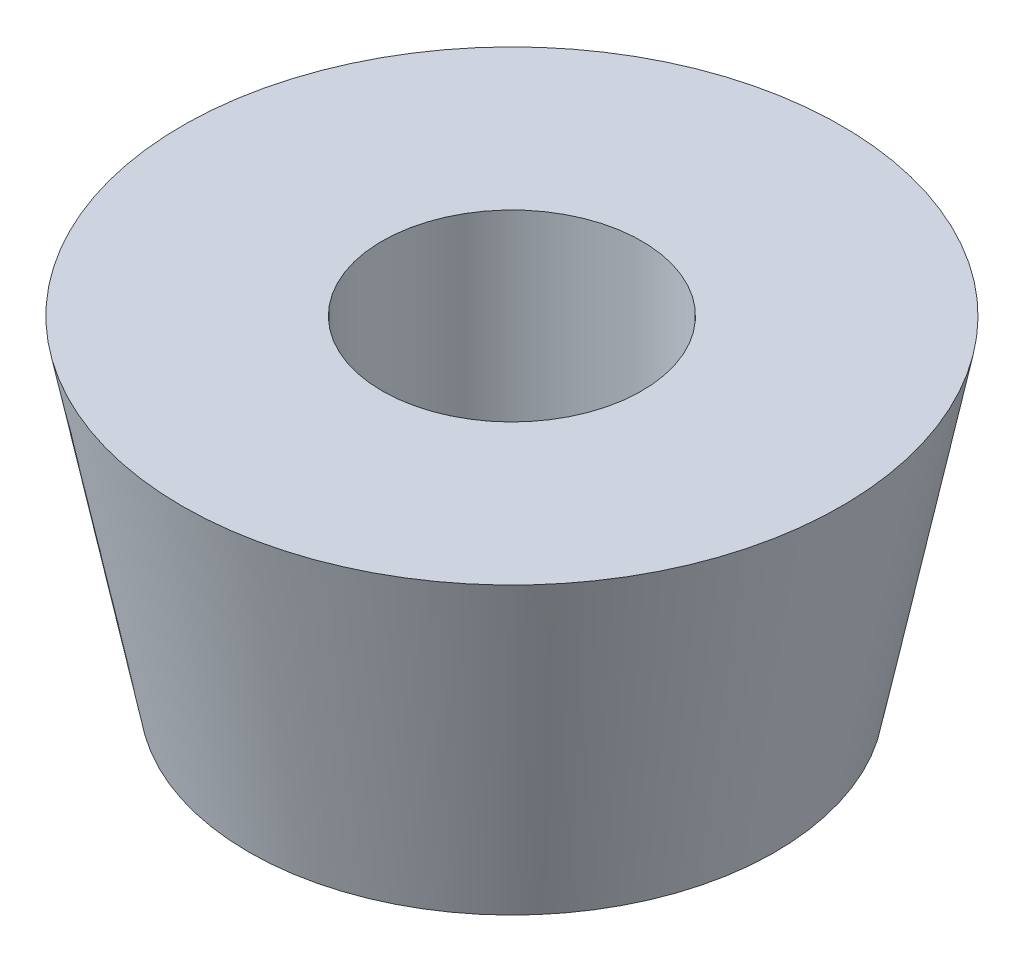
ISO-10303-21;
HEADER;
FILE_DESCRIPTION(('STEP AP214'),'2;1');
FILE_NAME('part.step','',(''),(''),'','','');
FILE_SCHEMA(('AUTOMOTIVE_DESIGN { 1 0 10303 214 1 1 1 1 }'));
ENDSEC;
DATA;
#1=APPLICATION_CONTEXT('core data for automotive mechanical design processes');
#2=APPLICATION_PROTOCOL_DEFINITION('international standard','automotive_design',2000,#1);
#3=PRODUCT_CONTEXT('',#1,'mechanical');
#4=PRODUCT('Part','Part','',(#3));
#5=PRODUCT_RELATED_PRODUCT_CATEGORY('part','',(#4));
#6=PRODUCT_DEFINITION_FORMATION('','',#4);
#7=PRODUCT_DEFINITION_CONTEXT('part definition',#1,'design');
#8=PRODUCT_DEFINITION('design','',#6,#7);
#9=PRODUCT_DEFINITION_SHAPE('','',#8);
#10=(LENGTH_UNIT() NAMED_UNIT(*) SI_UNIT(.MILLI.,.METRE.));
#11=(NAMED_UNIT(*) PLANE_ANGLE_UNIT() SI_UNIT($,.RADIAN.));
#12=(NAMED_UNIT(*) SI_UNIT($,.STERADIAN.) SOLID_ANGLE_UNIT());
#13=UNCERTAINTY_MEASURE_WITH_UNIT(LENGTH_MEASURE(1.E-05),#10,'distance_accuracy_value','');
#14=(GEOMETRIC_REPRESENTATION_CONTEXT(3) GLOBAL_UNCERTAINTY_ASSIGNED_CONTEXT((#13)) GLOBAL_UNIT_ASSIGNED_CONTEXT((#10,
#11,#12)) REPRESENTATION_CONTEXT('',''));
#15=CARTESIAN_POINT('',(0.,0.,0.));
#16=DIRECTION('',(0.,0.,1.));
#17=DIRECTION('',(1.,0.,0.));
#18=AXIS2_PLACEMENT_3D('',#15,#16,#17);
#19=CARTESIAN_POINT('',(4.95,0.,0.));
#20=DIRECTION('',(0.,-1.,0.));
#21=DIRECTION('',(0.,0.,-1.));
#22=AXIS2_PLACEMENT_3D('',#19,#20,#21);
#23=PLANE('',#22);
#24=CARTESIAN_POINT('',(0.,0.,0.));
#25=DIRECTION('',(0.,1.,0.));
#26=DIRECTION('',(0.,0.,1.));
#27=AXIS2_PLACEMENT_3D('',#24,#25,#26);
#28=CIRCLE('',#27,1.95);
#29=CARTESIAN_POINT('',(0.,0.,1.95));
#30=VERTEX_POINT('',#29);
#31=EDGE_CURVE('E10',#30,#30,#28,.T.);
#32=ORIENTED_EDGE('',*,*,#31,.F.);
#33=EDGE_LOOP('',(#32));
#34=FACE_BOUND('',#33,.T.);
#35=CARTESIAN_POINT('',(0.,0.,0.));
#36=DIRECTION('',(0.,1.,0.));
#37=DIRECTION('',(0.,0.,1.));
#38=AXIS2_PLACEMENT_3D('',#35,#36,#37);
#39=CIRCLE('',#38,4.95);
#40=CARTESIAN_POINT('',(0.,0.,4.95));
#41=VERTEX_POINT('',#40);
#42=EDGE_CURVE('E51',#41,#41,#39,.T.);
#43=ORIENTED_EDGE('',*,*,#42,.T.);
#44=EDGE_LOOP('',(#43));
#45=FACE_BOUND('',#44,.T.);
#46=ADVANCED_FACE('F40',(#34,#45),#23,.F.);
#47=CARTESIAN_POINT('',(0.,0.,0.));
#48=DIRECTION('',(0.,1.,0.));
#49=DIRECTION('',(0.,0.,1.));
#50=AXIS2_PLACEMENT_3D('',#47,#48,#49);
#51=CYLINDRICAL_SURFACE('',#50,1.95);
#52=CARTESIAN_POINT('',(0.,-5.,0.));
#53=DIRECTION('',(0.,1.,0.));
#54=DIRECTION('',(0.,0.,1.));
#55=AXIS2_PLACEMENT_3D('',#52,#53,#54);
#56=CIRCLE('',#55,1.95);
#57=CARTESIAN_POINT('',(0.,-5.,1.95));
#58=VERTEX_POINT('',#57);
#59=EDGE_CURVE('E43',#58,#58,#56,.T.);
#60=ORIENTED_EDGE('',*,*,#59,.F.);
#61=EDGE_LOOP('',(#60));
#62=FACE_BOUND('',#61,.T.);
#63=ORIENTED_EDGE('',*,*,#31,.T.);
#64=EDGE_LOOP('',(#63));
#65=FACE_BOUND('',#64,.T.);
#66=ADVANCED_FACE('F67',(#62,#65),#51,.F.);
#67=CARTESIAN_POINT('',(1.95,-5.,0.));
#68=DIRECTION('',(0.,1.,0.));
#69=DIRECTION('',(0.,0.,1.));
#70=AXIS2_PLACEMENT_3D('',#67,#68,#69);
#71=PLANE('',#70);
#72=CARTESIAN_POINT('',(0.,-5.,0.));
#73=DIRECTION('',(0.,1.,0.));
#74=DIRECTION('',(0.,0.,1.));
#75=AXIS2_PLACEMENT_3D('',#72,#73,#74);
#76=CIRCLE('',#75,3.95);
#77=CARTESIAN_POINT('',(0.,-5.,3.95));
#78=VERTEX_POINT('',#77);
#79=EDGE_CURVE('E50',#78,#78,#76,.T.);
#80=ORIENTED_EDGE('',*,*,#79,.F.);
#81=EDGE_LOOP('',(#80));
#82=FACE_BOUND('',#81,.T.);
#83=ORIENTED_EDGE('',*,*,#59,.T.);
#84=EDGE_LOOP('',(#83));
#85=FACE_BOUND('',#84,.T.);
#86=ADVANCED_FACE('F61',(#82,#85),#71,.F.);
#87=CARTESIAN_POINT('',(0.,-5.,0.));
#88=DIRECTION('',(0.,1.,0.));
#89=DIRECTION('',(0.,0.,1.));
#90=AXIS2_PLACEMENT_3D('',#87,#88,#89);
#91=CONICAL_SURFACE('',#90,3.95,0.197395559849881);
#92=ORIENTED_EDGE('',*,*,#42,.F.);
#93=EDGE_LOOP('',(#92));
#94=FACE_BOUND('',#93,.T.);
#95=ORIENTED_EDGE('',*,*,#79,.T.);
#96=EDGE_LOOP('',(#95));
#97=FACE_BOUND('',#96,.T.);
#98=ADVANCED_FACE('F59',(#94,#97),#91,.T.);
#99=CLOSED_SHELL('',(#46,#66,#86,#98));
#100=MANIFOLD_SOLID_BREP('B2',#99);
#101=ADVANCED_BREP_SHAPE_REPRESENTATION('',(#18,#100),#14);
#102=SHAPE_DEFINITION_REPRESENTATION(#9,#101);
ENDSEC;
END-ISO-10303-21;
